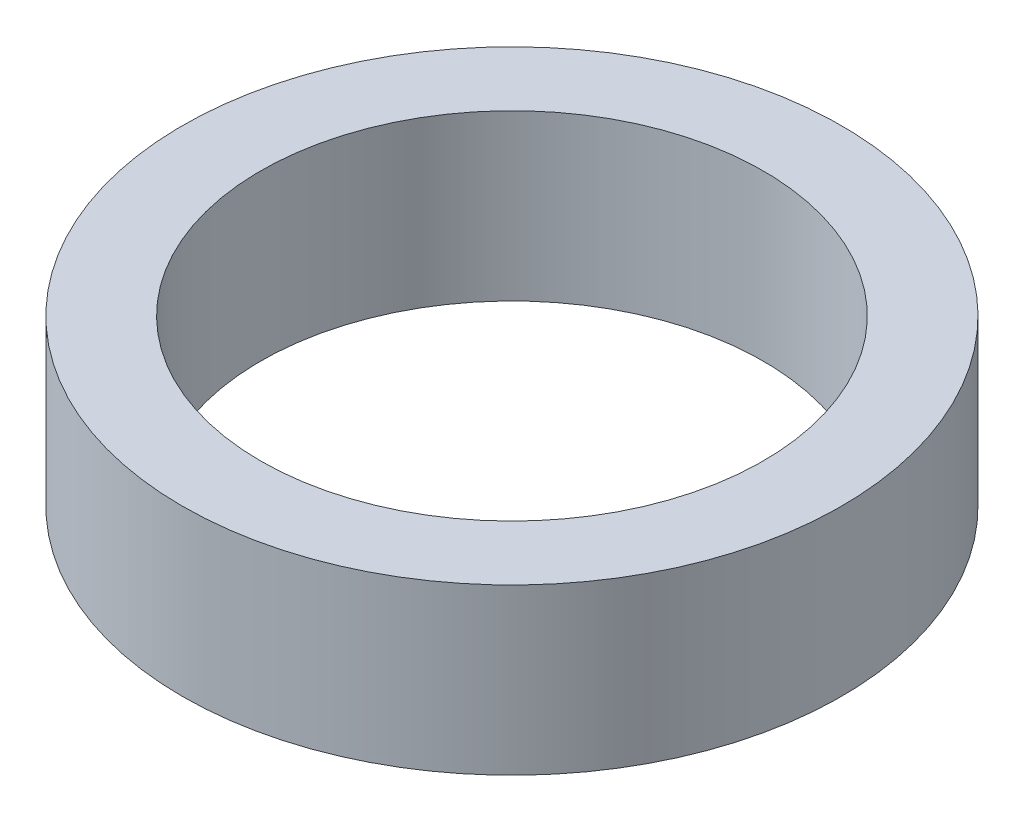
ISO-10303-21;
HEADER;
FILE_DESCRIPTION(('STEP AP214'),'2;1');
FILE_NAME('part.step','',(''),(''),'','','');
FILE_SCHEMA(('AUTOMOTIVE_DESIGN { 1 0 10303 214 1 1 1 1 }'));
ENDSEC;
DATA;
#1=APPLICATION_CONTEXT('core data for automotive mechanical design processes');
#2=APPLICATION_PROTOCOL_DEFINITION('international standard','automotive_design',2000,#1);
#3=PRODUCT_CONTEXT('',#1,'mechanical');
#4=PRODUCT('Part','Part','',(#3));
#5=PRODUCT_RELATED_PRODUCT_CATEGORY('part','',(#4));
#6=PRODUCT_DEFINITION_FORMATION('','',#4);
#7=PRODUCT_DEFINITION_CONTEXT('part definition',#1,'design');
#8=PRODUCT_DEFINITION('design','',#6,#7);
#9=PRODUCT_DEFINITION_SHAPE('','',#8);
#10=(LENGTH_UNIT() NAMED_UNIT(*) SI_UNIT(.MILLI.,.METRE.));
#11=(NAMED_UNIT(*) PLANE_ANGLE_UNIT() SI_UNIT($,.RADIAN.));
#12=(NAMED_UNIT(*) SI_UNIT($,.STERADIAN.) SOLID_ANGLE_UNIT());
#13=UNCERTAINTY_MEASURE_WITH_UNIT(LENGTH_MEASURE(1.E-05),#10,'distance_accuracy_value','');
#14=(GEOMETRIC_REPRESENTATION_CONTEXT(3) GLOBAL_UNCERTAINTY_ASSIGNED_CONTEXT((#13)) GLOBAL_UNIT_ASSIGNED_CONTEXT((#10,
#11,#12)) REPRESENTATION_CONTEXT('',''));
#15=CARTESIAN_POINT('',(0.,0.,0.));
#16=DIRECTION('',(0.,0.,1.));
#17=DIRECTION('',(1.,0.,0.));
#18=AXIS2_PLACEMENT_3D('',#15,#16,#17);
#19=CARTESIAN_POINT('',(8.0056,0.005599999999959,8.0056));
#20=DIRECTION('',(0.,1.,0.));
#21=DIRECTION('',(0.,0.,1.));
#22=AXIS2_PLACEMENT_3D('',#19,#20,#21);
#23=CYLINDRICAL_SURFACE('',#22,6.1);
#24=CARTESIAN_POINT('',(8.0056,0.005599999999959,8.0056));
#25=DIRECTION('',(0.,1.,0.));
#26=DIRECTION('',(0.,0.,1.));
#27=AXIS2_PLACEMENT_3D('',#24,#25,#26);
#28=CIRCLE('',#27,6.1);
#29=CARTESIAN_POINT('',(8.0056,0.005599999999959,14.1056));
#30=VERTEX_POINT('',#29);
#31=EDGE_CURVE('E26',#30,#30,#28,.F.);
#32=ORIENTED_EDGE('',*,*,#31,.T.);
#33=EDGE_LOOP('',(#32));
#34=FACE_BOUND('',#33,.T.);
#35=CARTESIAN_POINT('',(8.0056,4.0056,8.0056));
#36=DIRECTION('',(0.,1.,0.));
#37=DIRECTION('',(0.,0.,1.));
#38=AXIS2_PLACEMENT_3D('',#35,#36,#37);
#39=CIRCLE('',#38,6.1);
#40=CARTESIAN_POINT('',(8.0056,4.0056,14.1056));
#41=VERTEX_POINT('',#40);
#42=EDGE_CURVE('E17',#41,#41,#39,.F.);
#43=ORIENTED_EDGE('',*,*,#42,.F.);
#44=EDGE_LOOP('',(#43));
#45=FACE_BOUND('',#44,.T.);
#46=ADVANCED_FACE('F14',(#34,#45),#23,.F.);
#47=CARTESIAN_POINT('',(8.0056,4.0056,8.0056));
#48=DIRECTION('',(0.,1.,0.));
#49=DIRECTION('',(0.,0.,1.));
#50=AXIS2_PLACEMENT_3D('',#47,#48,#49);
#51=PLANE('',#50);
#52=ORIENTED_EDGE('',*,*,#42,.T.);
#53=EDGE_LOOP('',(#52));
#54=FACE_BOUND('',#53,.T.);
#55=CARTESIAN_POINT('',(8.0056,4.0056,8.0056));
#56=DIRECTION('',(0.,1.,0.));
#57=DIRECTION('',(0.,0.,1.));
#58=AXIS2_PLACEMENT_3D('',#55,#56,#57);
#59=CIRCLE('',#58,8.);
#60=CARTESIAN_POINT('',(8.0056,4.0056,16.0056));
#61=VERTEX_POINT('',#60);
#62=EDGE_CURVE('E21',#61,#61,#59,.F.);
#63=ORIENTED_EDGE('',*,*,#62,.F.);
#64=EDGE_LOOP('',(#63));
#65=FACE_BOUND('',#64,.T.);
#66=ADVANCED_FACE('F34',(#54,#65),#51,.T.);
#67=CARTESIAN_POINT('',(8.0056,0.005599999999959,8.0056));
#68=DIRECTION('',(0.,1.,0.));
#69=DIRECTION('',(0.,0.,1.));
#70=AXIS2_PLACEMENT_3D('',#67,#68,#69);
#71=PLANE('',#70);
#72=ORIENTED_EDGE('',*,*,#31,.F.);
#73=EDGE_LOOP('',(#72));
#74=FACE_BOUND('',#73,.T.);
#75=CARTESIAN_POINT('',(8.0056,0.005599999999959,8.0056));
#76=DIRECTION('',(0.,1.,0.));
#77=DIRECTION('',(0.,0.,1.));
#78=AXIS2_PLACEMENT_3D('',#75,#76,#77);
#79=CIRCLE('',#78,8.);
#80=CARTESIAN_POINT('',(8.0056,0.005599999999959,16.0056));
#81=VERTEX_POINT('',#80);
#82=EDGE_CURVE('E10',#81,#81,#79,.T.);
#83=ORIENTED_EDGE('',*,*,#82,.F.);
#84=EDGE_LOOP('',(#83));
#85=FACE_BOUND('',#84,.T.);
#86=ADVANCED_FACE('F42',(#74,#85),#71,.F.);
#87=CARTESIAN_POINT('',(8.0056,0.005599999999959,8.0056));
#88=DIRECTION('',(0.,1.,0.));
#89=DIRECTION('',(0.,0.,1.));
#90=AXIS2_PLACEMENT_3D('',#87,#88,#89);
#91=CYLINDRICAL_SURFACE('',#90,8.);
#92=ORIENTED_EDGE('',*,*,#82,.T.);
#93=EDGE_LOOP('',(#92));
#94=FACE_BOUND('',#93,.T.);
#95=ORIENTED_EDGE('',*,*,#62,.T.);
#96=EDGE_LOOP('',(#95));
#97=FACE_BOUND('',#96,.T.);
#98=ADVANCED_FACE('F43',(#94,#97),#91,.T.);
#99=CLOSED_SHELL('',(#46,#66,#86,#98));
#100=MANIFOLD_SOLID_BREP('B1',#99);
#101=ADVANCED_BREP_SHAPE_REPRESENTATION('',(#18,#100),#14);
#102=SHAPE_DEFINITION_REPRESENTATION(#9,#101);
ENDSEC;
END-ISO-10303-21;
